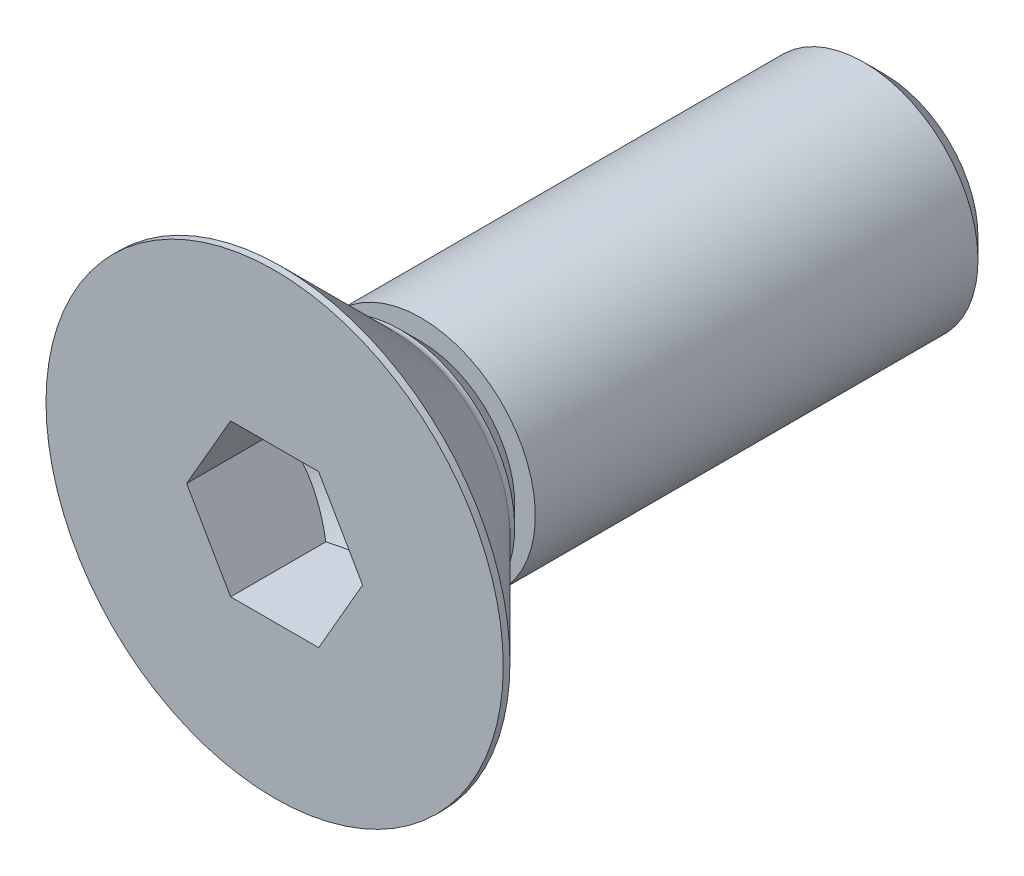
ISO-10303-21;
HEADER;
FILE_DESCRIPTION(('STEP AP214'),'2;1');
FILE_NAME('part.step','',(''),(''),'','','');
FILE_SCHEMA(('AUTOMOTIVE_DESIGN { 1 0 10303 214 1 1 1 1 }'));
ENDSEC;
DATA;
#1=APPLICATION_CONTEXT('core data for automotive mechanical design processes');
#2=APPLICATION_PROTOCOL_DEFINITION('international standard','automotive_design',2000,#1);
#3=PRODUCT_CONTEXT('',#1,'mechanical');
#4=PRODUCT('Part','Part','',(#3));
#5=PRODUCT_RELATED_PRODUCT_CATEGORY('part','',(#4));
#6=PRODUCT_DEFINITION_FORMATION('','',#4);
#7=PRODUCT_DEFINITION_CONTEXT('part definition',#1,'design');
#8=PRODUCT_DEFINITION('design','',#6,#7);
#9=PRODUCT_DEFINITION_SHAPE('','',#8);
#10=(LENGTH_UNIT() NAMED_UNIT(*) SI_UNIT(.MILLI.,.METRE.));
#11=(NAMED_UNIT(*) PLANE_ANGLE_UNIT() SI_UNIT($,.RADIAN.));
#12=(NAMED_UNIT(*) SI_UNIT($,.STERADIAN.) SOLID_ANGLE_UNIT());
#13=UNCERTAINTY_MEASURE_WITH_UNIT(LENGTH_MEASURE(1.E-05),#10,'distance_accuracy_value','');
#14=(GEOMETRIC_REPRESENTATION_CONTEXT(3) GLOBAL_UNCERTAINTY_ASSIGNED_CONTEXT((#13)) GLOBAL_UNIT_ASSIGNED_CONTEXT((#10,
#11,#12)) REPRESENTATION_CONTEXT('',''));
#15=CARTESIAN_POINT('',(0.,0.,0.));
#16=DIRECTION('',(0.,0.,1.));
#17=DIRECTION('',(1.,0.,0.));
#18=AXIS2_PLACEMENT_3D('',#15,#16,#17);
#19=CARTESIAN_POINT('',(0.,1.229375,-16.));
#20=DIRECTION('',(0.,0.,-1.));
#21=DIRECTION('',(0.,1.,0.));
#22=AXIS2_PLACEMENT_3D('',#19,#20,#21);
#23=PLANE('',#22);
#24=CARTESIAN_POINT('',(0.,0.,-16.));
#25=DIRECTION('',(0.,0.,-1.));
#26=DIRECTION('',(0.,1.,0.));
#27=AXIS2_PLACEMENT_3D('',#24,#25,#26);
#28=CIRCLE('',#27,2.45875);
#29=CARTESIAN_POINT('',(0.,2.45875,-16.));
#30=VERTEX_POINT('',#29);
#31=EDGE_CURVE('E11',#30,#30,#28,.T.);
#32=ORIENTED_EDGE('',*,*,#31,.T.);
#33=EDGE_LOOP('',(#32));
#34=FACE_BOUND('',#33,.T.);
#35=ADVANCED_FACE('F16',(#34),#23,.T.);
#36=CARTESIAN_POINT('',(0.,0.,-15.729375));
#37=DIRECTION('',(0.,0.,1.));
#38=DIRECTION('',(0.,1.,0.));
#39=AXIS2_PLACEMENT_3D('',#36,#37,#38);
#40=CONICAL_SURFACE('',#39,2.729375,0.785398163397448);
#41=CARTESIAN_POINT('',(0.,0.,-15.45875));
#42=DIRECTION('',(0.,0.,-1.));
#43=DIRECTION('',(0.,1.,0.));
#44=AXIS2_PLACEMENT_3D('',#41,#42,#43);
#45=CIRCLE('',#44,3.);
#46=CARTESIAN_POINT('',(0.,3.,-15.45875));
#47=VERTEX_POINT('',#46);
#48=EDGE_CURVE('E25',#47,#47,#45,.T.);
#49=ORIENTED_EDGE('',*,*,#48,.T.);
#50=EDGE_LOOP('',(#49));
#51=FACE_BOUND('',#50,.T.);
#52=ORIENTED_EDGE('',*,*,#31,.F.);
#53=EDGE_LOOP('',(#52));
#54=FACE_BOUND('',#53,.T.);
#55=ADVANCED_FACE('F189',(#51,#54),#40,.T.);
#56=CARTESIAN_POINT('',(0.,0.,-9.529375));
#57=DIRECTION('',(0.,0.,1.));
#58=DIRECTION('',(0.,1.,0.));
#59=AXIS2_PLACEMENT_3D('',#56,#57,#58);
#60=CYLINDRICAL_SURFACE('',#59,3.);
#61=ORIENTED_EDGE('',*,*,#48,.F.);
#62=EDGE_LOOP('',(#61));
#63=FACE_BOUND('',#62,.T.);
#64=CARTESIAN_POINT('',(0.,0.,-3.84125));
#65=DIRECTION('',(0.,0.,-1.));
#66=DIRECTION('',(0.,1.,0.));
#67=AXIS2_PLACEMENT_3D('',#64,#65,#66);
#68=CIRCLE('',#67,3.);
#69=CARTESIAN_POINT('',(0.,-3.,-3.84125));
#70=VERTEX_POINT('',#69);
#71=EDGE_CURVE('E98',#70,#70,#68,.T.);
#72=ORIENTED_EDGE('',*,*,#71,.T.);
#73=EDGE_LOOP('',(#72));
#74=FACE_BOUND('',#73,.T.);
#75=ADVANCED_FACE('F193',(#63,#74),#60,.T.);
#76=CARTESIAN_POINT('',(0.,0.,-3.3));
#77=DIRECTION('',(0.,0.,-1.));
#78=DIRECTION('',(-1.,0.,0.));
#79=AXIS2_PLACEMENT_3D('',#76,#77,#78);
#80=TOROIDAL_SURFACE('',#79,3.3,0.3);
#81=CARTESIAN_POINT('',(0.,0.,-3.08786796564404));
#82=DIRECTION('',(0.,0.,-1.));
#83=DIRECTION('',(0.,1.,0.));
#84=AXIS2_PLACEMENT_3D('',#81,#82,#83);
#85=CIRCLE('',#84,3.08786796564404);
#86=CARTESIAN_POINT('',(0.,3.08786796564404,-3.08786796564404));
#87=VERTEX_POINT('',#86);
#88=EDGE_CURVE('E124',#87,#87,#85,.T.);
#89=ORIENTED_EDGE('',*,*,#88,.T.);
#90=EDGE_LOOP('',(#89));
#91=FACE_BOUND('',#90,.T.);
#92=CARTESIAN_POINT('',(0.,0.,-3.3));
#93=DIRECTION('',(0.,0.,-1.));
#94=DIRECTION('',(0.,1.,0.));
#95=AXIS2_PLACEMENT_3D('',#92,#93,#94);
#96=CIRCLE('',#95,3.);
#97=CARTESIAN_POINT('',(0.,3.,-3.3));
#98=VERTEX_POINT('',#97);
#99=EDGE_CURVE('E19',#98,#98,#96,.T.);
#100=ORIENTED_EDGE('',*,*,#99,.F.);
#101=EDGE_LOOP('',(#100));
#102=FACE_BOUND('',#101,.T.);
#103=ADVANCED_FACE('F199',(#91,#102),#80,.F.);
#104=CARTESIAN_POINT('',(0.,0.,-1.63180194846605));
#105=DIRECTION('',(0.,0.,1.));
#106=DIRECTION('',(0.,1.,0.));
#107=AXIS2_PLACEMENT_3D('',#104,#105,#106);
#108=CONICAL_SURFACE('',#107,4.54393398282202,0.785398163397448);
#109=CARTESIAN_POINT('',(0.,0.,-0.17573593128807));
#110=DIRECTION('',(0.,0.,-1.));
#111=DIRECTION('',(0.,1.,0.));
#112=AXIS2_PLACEMENT_3D('',#109,#110,#111);
#113=CIRCLE('',#112,6.);
#114=CARTESIAN_POINT('',(0.,6.,-0.17573593128807));
#115=VERTEX_POINT('',#114);
#116=EDGE_CURVE('E133',#115,#115,#113,.T.);
#117=ORIENTED_EDGE('',*,*,#116,.T.);
#118=EDGE_LOOP('',(#117));
#119=FACE_BOUND('',#118,.T.);
#120=ORIENTED_EDGE('',*,*,#88,.F.);
#121=EDGE_LOOP('',(#120));
#122=FACE_BOUND('',#121,.T.);
#123=ADVANCED_FACE('F222',(#119,#122),#108,.T.);
#124=CARTESIAN_POINT('',(0.,0.,-0.0878679656440351));
#125=DIRECTION('',(0.,0.,1.));
#126=DIRECTION('',(0.,1.,0.));
#127=AXIS2_PLACEMENT_3D('',#124,#125,#126);
#128=CYLINDRICAL_SURFACE('',#127,6.);
#129=CARTESIAN_POINT('',(0.,0.,0.));
#130=DIRECTION('',(0.,0.,-1.));
#131=DIRECTION('',(0.,1.,0.));
#132=AXIS2_PLACEMENT_3D('',#129,#130,#131);
#133=CIRCLE('',#132,6.);
#134=CARTESIAN_POINT('',(0.,6.,0.));
#135=VERTEX_POINT('',#134);
#136=EDGE_CURVE('E69',#135,#135,#133,.T.);
#137=ORIENTED_EDGE('',*,*,#136,.T.);
#138=EDGE_LOOP('',(#137));
#139=FACE_BOUND('',#138,.T.);
#140=ORIENTED_EDGE('',*,*,#116,.F.);
#141=EDGE_LOOP('',(#140));
#142=FACE_BOUND('',#141,.T.);
#143=ADVANCED_FACE('F216',(#139,#142),#128,.T.);
#144=CARTESIAN_POINT('',(0.,3.,0.));
#145=DIRECTION('',(0.,0.,1.));
#146=DIRECTION('',(0.,-1.,0.));
#147=AXIS2_PLACEMENT_3D('',#144,#145,#146);
#148=PLANE('',#147);
#149=ORIENTED_EDGE('',*,*,#136,.F.);
#150=EDGE_LOOP('',(#149));
#151=FACE_BOUND('',#150,.T.);
#152=DIRECTION('',(-0.5,0.866025403784439,0.));
#153=VECTOR('',#152,1.);
#154=CARTESIAN_POINT('',(-2.38156905283833,0.125000466250108,0.));
#155=LINE('',#154,#153);
#156=CARTESIAN_POINT('',(-1.1547,-1.99999906749978,0.));
#157=VERTEX_POINT('',#156);
#158=CARTESIAN_POINT('',(-2.3094,0.,0.));
#159=VERTEX_POINT('',#158);
#160=EDGE_CURVE('E66',#157,#159,#155,.T.);
#161=ORIENTED_EDGE('',*,*,#160,.T.);
#162=DIRECTION('',(0.5,0.866025403784439,0.));
#163=VECTOR('',#162,1.);
#164=CARTESIAN_POINT('',(-1.08253094716167,2.12499953374989,0.));
#165=LINE('',#164,#163);
#166=CARTESIAN_POINT('',(-1.1547,1.99999906749978,0.));
#167=VERTEX_POINT('',#166);
#168=EDGE_CURVE('E56',#159,#167,#165,.T.);
#169=ORIENTED_EDGE('',*,*,#168,.T.);
#170=DIRECTION('',(1.,0.,0.));
#171=VECTOR('',#170,1.);
#172=CARTESIAN_POINT('',(0.,1.99999906749978,0.));
#173=LINE('',#172,#171);
#174=CARTESIAN_POINT('',(1.1547,1.99999906749978,0.));
#175=VERTEX_POINT('',#174);
#176=EDGE_CURVE('E62',#167,#175,#173,.T.);
#177=ORIENTED_EDGE('',*,*,#176,.T.);
#178=DIRECTION('',(0.5,-0.866025403784439,0.));
#179=VECTOR('',#178,1.);
#180=CARTESIAN_POINT('',(1.08253094716167,2.12499953374989,0.));
#181=LINE('',#180,#179);
#182=CARTESIAN_POINT('',(2.3094,0.,0.));
#183=VERTEX_POINT('',#182);
#184=EDGE_CURVE('E146',#175,#183,#181,.T.);
#185=ORIENTED_EDGE('',*,*,#184,.T.);
#186=DIRECTION('',(-0.5,-0.866025403784439,0.));
#187=VECTOR('',#186,1.);
#188=CARTESIAN_POINT('',(2.38156905283833,0.125000466250108,0.));
#189=LINE('',#188,#187);
#190=CARTESIAN_POINT('',(1.1547,-1.99999906749978,0.));
#191=VERTEX_POINT('',#190);
#192=EDGE_CURVE('E97',#183,#191,#189,.T.);
#193=ORIENTED_EDGE('',*,*,#192,.T.);
#194=DIRECTION('',(-1.,0.,0.));
#195=VECTOR('',#194,1.);
#196=CARTESIAN_POINT('',(0.,-1.99999906749978,0.));
#197=LINE('',#196,#195);
#198=EDGE_CURVE('E121',#191,#157,#197,.T.);
#199=ORIENTED_EDGE('',*,*,#198,.T.);
#200=EDGE_LOOP('',(#161,#169,#177,#185,#193,#199));
#201=FACE_BOUND('',#200,.T.);
#202=ADVANCED_FACE('F58',(#151,#201),#148,.T.);
#203=CARTESIAN_POINT('',(-1.73205,0.999999533749891,1.));
#204=DIRECTION('',(-0.866025403784439,0.5,0.));
#205=DIRECTION('',(0.5,0.866025403784439,0.));
#206=AXIS2_PLACEMENT_3D('',#203,#204,#205);
#207=PLANE('',#206);
#208=ORIENTED_EDGE('',*,*,#168,.F.);
#209=DIRECTION('',(0.,0.,-1.));
#210=VECTOR('',#209,1.);
#211=CARTESIAN_POINT('',(-2.3094,0.,1.));
#212=LINE('',#211,#210);
#213=CARTESIAN_POINT('',(-2.3094,0.,-2.5));
#214=VERTEX_POINT('',#213);
#215=EDGE_CURVE('E84',#159,#214,#212,.T.);
#216=ORIENTED_EDGE('',*,*,#215,.T.);
#217=CARTESIAN_POINT('',(-2.3094,0.,-2.5));
#218=CARTESIAN_POINT('',(-1.73205,0.999999533749893,-2.83333317791663));
#219=CARTESIAN_POINT('',(-1.1547,1.99999906749978,-2.5));
#220=(BOUNDED_CURVE() B_SPLINE_CURVE(2,(#217,#218,#219),.UNSPECIFIED.,.F.,
.F.) B_SPLINE_CURVE_WITH_KNOTS((3,3),(0.,2.33687118658889),
.UNSPECIFIED.) CURVE() GEOMETRIC_REPRESENTATION_ITEM() RATIONAL_B_SPLINE_CURVE((1.,
1.15470053837925,1.)) REPRESENTATION_ITEM(''));
#221=CARTESIAN_POINT('',(-1.1547,1.99999906749978,-2.5));
#222=VERTEX_POINT('',#221);
#223=EDGE_CURVE('E75',#214,#222,#220,.T.);
#224=ORIENTED_EDGE('',*,*,#223,.T.);
#225=DIRECTION('',(0.,0.,-1.));
#226=VECTOR('',#225,1.);
#227=CARTESIAN_POINT('',(-1.1547,1.99999906749978,1.));
#228=LINE('',#227,#226);
#229=EDGE_CURVE('E70',#167,#222,#228,.T.);
#230=ORIENTED_EDGE('',*,*,#229,.F.);
#231=EDGE_LOOP('',(#208,#216,#224,#230));
#232=FACE_BOUND('',#231,.T.);
#233=ADVANCED_FACE('F73',(#232),#207,.F.);
#234=CARTESIAN_POINT('',(0.,1.99999906749978,1.));
#235=DIRECTION('',(0.,1.,0.));
#236=DIRECTION('',(1.,0.,0.));
#237=AXIS2_PLACEMENT_3D('',#234,#235,#236);
#238=PLANE('',#237);
#239=ORIENTED_EDGE('',*,*,#176,.F.);
#240=ORIENTED_EDGE('',*,*,#229,.T.);
#241=CARTESIAN_POINT('',(-1.1547,1.99999906749978,-2.5));
#242=CARTESIAN_POINT('',(0.,1.99999906749979,-2.83333317791663));
#243=CARTESIAN_POINT('',(1.1547,1.99999906749978,-2.5));
#244=(BOUNDED_CURVE() B_SPLINE_CURVE(2,(#241,#242,#243),.UNSPECIFIED.,.F.,
.F.) B_SPLINE_CURVE_WITH_KNOTS((3,3),(0.,2.33687118658889),
.UNSPECIFIED.) CURVE() GEOMETRIC_REPRESENTATION_ITEM() RATIONAL_B_SPLINE_CURVE((1.,
1.15470053837925,1.)) REPRESENTATION_ITEM(''));
#245=CARTESIAN_POINT('',(1.1547,1.99999906749978,-2.5));
#246=VERTEX_POINT('',#245);
#247=EDGE_CURVE('E103',#222,#246,#244,.T.);
#248=ORIENTED_EDGE('',*,*,#247,.T.);
#249=DIRECTION('',(0.,0.,-1.));
#250=VECTOR('',#249,1.);
#251=CARTESIAN_POINT('',(1.1547,1.99999906749978,1.));
#252=LINE('',#251,#250);
#253=EDGE_CURVE('E82',#175,#246,#252,.T.);
#254=ORIENTED_EDGE('',*,*,#253,.F.);
#255=EDGE_LOOP('',(#239,#240,#248,#254));
#256=FACE_BOUND('',#255,.T.);
#257=ADVANCED_FACE('F80',(#256),#238,.F.);
#258=CARTESIAN_POINT('',(-1.73205,-0.999999533749891,1.));
#259=DIRECTION('',(-0.866025403784439,-0.5,0.));
#260=DIRECTION('',(-0.5,0.866025403784439,0.));
#261=AXIS2_PLACEMENT_3D('',#258,#259,#260);
#262=PLANE('',#261);
#263=ORIENTED_EDGE('',*,*,#160,.F.);
#264=DIRECTION('',(0.,0.,-1.));
#265=VECTOR('',#264,1.);
#266=CARTESIAN_POINT('',(-1.1547,-1.99999906749978,1.));
#267=LINE('',#266,#265);
#268=CARTESIAN_POINT('',(-1.1547,-1.99999906749978,-2.5));
#269=VERTEX_POINT('',#268);
#270=EDGE_CURVE('E106',#157,#269,#267,.T.);
#271=ORIENTED_EDGE('',*,*,#270,.T.);
#272=CARTESIAN_POINT('',(-1.1547,-1.99999906749978,-2.5));
#273=CARTESIAN_POINT('',(-1.73205,-0.999999533749891,-2.83333317791663));
#274=CARTESIAN_POINT('',(-2.3094,0.,-2.5));
#275=(BOUNDED_CURVE() B_SPLINE_CURVE(2,(#272,#273,#274),.UNSPECIFIED.,.F.,
.F.) B_SPLINE_CURVE_WITH_KNOTS((3,3),(0.,2.33687118658889),
.UNSPECIFIED.) CURVE() GEOMETRIC_REPRESENTATION_ITEM() RATIONAL_B_SPLINE_CURVE((1.,
1.15470053837925,1.)) REPRESENTATION_ITEM(''));
#276=EDGE_CURVE('E112',#269,#214,#275,.T.);
#277=ORIENTED_EDGE('',*,*,#276,.T.);
#278=ORIENTED_EDGE('',*,*,#215,.F.);
#279=EDGE_LOOP('',(#263,#271,#277,#278));
#280=FACE_BOUND('',#279,.T.);
#281=ADVANCED_FACE('F209',(#280),#262,.F.);
#282=CARTESIAN_POINT('',(0.,0.,-3.16666635583326));
#283=DIRECTION('',(0.,0.,1.));
#284=DIRECTION('',(0.,1.,0.));
#285=AXIS2_PLACEMENT_3D('',#282,#283,#284);
#286=CONICAL_SURFACE('',#285,1.1547,1.0471975511966);
#287=CARTESIAN_POINT('',(0.,0.,-3.83333271166652));
#288=VERTEX_POINT('',#287);
#289=VERTEX_LOOP('',#288);
#290=FACE_BOUND('',#289,.T.);
#291=CARTESIAN_POINT('',(1.1547,1.99999906749978,-2.5));
#292=CARTESIAN_POINT('',(1.73205,0.999999533749893,-2.83333317791663));
#293=CARTESIAN_POINT('',(2.3094,0.,-2.5));
#294=(BOUNDED_CURVE() B_SPLINE_CURVE(2,(#291,#292,#293),.UNSPECIFIED.,.F.,
.F.) B_SPLINE_CURVE_WITH_KNOTS((3,3),(0.,2.33687118658889),
.UNSPECIFIED.) CURVE() GEOMETRIC_REPRESENTATION_ITEM() RATIONAL_B_SPLINE_CURVE((1.,
1.15470053837925,1.)) REPRESENTATION_ITEM(''));
#295=CARTESIAN_POINT('',(2.3094,0.,-2.5));
#296=VERTEX_POINT('',#295);
#297=EDGE_CURVE('E139',#246,#296,#294,.T.);
#298=ORIENTED_EDGE('',*,*,#297,.F.);
#299=ORIENTED_EDGE('',*,*,#247,.F.);
#300=ORIENTED_EDGE('',*,*,#223,.F.);
#301=ORIENTED_EDGE('',*,*,#276,.F.);
#302=CARTESIAN_POINT('',(1.1547,-1.99999906749978,-2.5));
#303=CARTESIAN_POINT('',(0.,-1.99999906749979,-2.83333317791663));
#304=CARTESIAN_POINT('',(-1.1547,-1.99999906749978,-2.5));
#305=(BOUNDED_CURVE() B_SPLINE_CURVE(2,(#302,#303,#304),.UNSPECIFIED.,.F.,
.F.) B_SPLINE_CURVE_WITH_KNOTS((3,3),(0.,2.33687118658889),
.UNSPECIFIED.) CURVE() GEOMETRIC_REPRESENTATION_ITEM() RATIONAL_B_SPLINE_CURVE((1.,
1.15470053837925,1.)) REPRESENTATION_ITEM(''));
#306=CARTESIAN_POINT('',(1.1547,-1.99999906749978,-2.5));
#307=VERTEX_POINT('',#306);
#308=EDGE_CURVE('E115',#307,#269,#305,.T.);
#309=ORIENTED_EDGE('',*,*,#308,.F.);
#310=CARTESIAN_POINT('',(2.3094,0.,-2.5));
#311=CARTESIAN_POINT('',(1.73205,-0.999999533749891,-2.83333317791663));
#312=CARTESIAN_POINT('',(1.1547,-1.99999906749978,-2.5));
#313=(BOUNDED_CURVE() B_SPLINE_CURVE(2,(#310,#311,#312),.UNSPECIFIED.,.F.,
.F.) B_SPLINE_CURVE_WITH_KNOTS((3,3),(0.,2.33687118658888),
.UNSPECIFIED.) CURVE() GEOMETRIC_REPRESENTATION_ITEM() RATIONAL_B_SPLINE_CURVE((1.,
1.15470053837925,1.)) REPRESENTATION_ITEM(''));
#314=EDGE_CURVE('E91',#296,#307,#313,.T.);
#315=ORIENTED_EDGE('',*,*,#314,.F.);
#316=EDGE_LOOP('',(#298,#299,#300,#301,#309,#315));
#317=FACE_BOUND('',#316,.T.);
#318=ADVANCED_FACE('F205',(#290,#317),#286,.F.);
#319=CARTESIAN_POINT('',(0.,-1.99999906749978,1.));
#320=DIRECTION('',(0.,-1.,0.));
#321=DIRECTION('',(-1.,0.,0.));
#322=AXIS2_PLACEMENT_3D('',#319,#320,#321);
#323=PLANE('',#322);
#324=ORIENTED_EDGE('',*,*,#198,.F.);
#325=DIRECTION('',(0.,0.,-1.));
#326=VECTOR('',#325,1.);
#327=CARTESIAN_POINT('',(1.1547,-1.99999906749978,1.));
#328=LINE('',#327,#326);
#329=EDGE_CURVE('E96',#191,#307,#328,.T.);
#330=ORIENTED_EDGE('',*,*,#329,.T.);
#331=ORIENTED_EDGE('',*,*,#308,.T.);
#332=ORIENTED_EDGE('',*,*,#270,.F.);
#333=EDGE_LOOP('',(#324,#330,#331,#332));
#334=FACE_BOUND('',#333,.T.);
#335=ADVANCED_FACE('F211',(#334),#323,.F.);
#336=CARTESIAN_POINT('',(1.73205,-0.999999533749891,1.));
#337=DIRECTION('',(0.866025403784439,-0.5,0.));
#338=DIRECTION('',(-0.5,-0.866025403784439,0.));
#339=AXIS2_PLACEMENT_3D('',#336,#337,#338);
#340=PLANE('',#339);
#341=ORIENTED_EDGE('',*,*,#192,.F.);
#342=DIRECTION('',(0.,0.,-1.));
#343=VECTOR('',#342,1.);
#344=CARTESIAN_POINT('',(2.3094,0.,1.));
#345=LINE('',#344,#343);
#346=EDGE_CURVE('E136',#183,#296,#345,.T.);
#347=ORIENTED_EDGE('',*,*,#346,.T.);
#348=ORIENTED_EDGE('',*,*,#314,.T.);
#349=ORIENTED_EDGE('',*,*,#329,.F.);
#350=EDGE_LOOP('',(#341,#347,#348,#349));
#351=FACE_BOUND('',#350,.T.);
#352=ADVANCED_FACE('F186',(#351),#340,.F.);
#353=CARTESIAN_POINT('',(1.73205,0.999999533749891,1.));
#354=DIRECTION('',(0.866025403784439,0.5,0.));
#355=DIRECTION('',(0.5,-0.866025403784439,0.));
#356=AXIS2_PLACEMENT_3D('',#353,#354,#355);
#357=PLANE('',#356);
#358=ORIENTED_EDGE('',*,*,#184,.F.);
#359=ORIENTED_EDGE('',*,*,#253,.T.);
#360=ORIENTED_EDGE('',*,*,#297,.T.);
#361=ORIENTED_EDGE('',*,*,#346,.F.);
#362=EDGE_LOOP('',(#358,#359,#360,#361));
#363=FACE_BOUND('',#362,.T.);
#364=ADVANCED_FACE('F178',(#363),#357,.F.);
#365=CARTESIAN_POINT('',(0.,0.,-3.570625));
#366=DIRECTION('',(0.,0.,1.));
#367=DIRECTION('',(0.,1.,0.));
#368=AXIS2_PLACEMENT_3D('',#365,#366,#367);
#369=CONICAL_SURFACE('',#368,2.729375,0.785398163397448);
#370=CARTESIAN_POINT('',(0.,0.,-3.84125));
#371=DIRECTION('',(0.,0.,-1.));
#372=DIRECTION('',(0.,1.,0.));
#373=AXIS2_PLACEMENT_3D('',#370,#371,#372);
#374=CIRCLE('',#373,2.45875);
#375=CARTESIAN_POINT('',(0.,2.45875,-3.84125));
#376=VERTEX_POINT('',#375);
#377=EDGE_CURVE('E89',#376,#376,#374,.T.);
#378=ORIENTED_EDGE('',*,*,#377,.F.);
#379=EDGE_LOOP('',(#378));
#380=FACE_BOUND('',#379,.T.);
#381=ORIENTED_EDGE('',*,*,#99,.T.);
#382=EDGE_LOOP('',(#381));
#383=FACE_BOUND('',#382,.T.);
#384=ADVANCED_FACE('F176',(#380,#383),#369,.T.);
#385=CARTESIAN_POINT('',(0.,3.229375,-3.84125));
#386=DIRECTION('',(0.,0.,-1.));
#387=DIRECTION('',(0.,1.,0.));
#388=AXIS2_PLACEMENT_3D('',#385,#386,#387);
#389=PLANE('',#388);
#390=ORIENTED_EDGE('',*,*,#377,.T.);
#391=EDGE_LOOP('',(#390));
#392=FACE_BOUND('',#391,.T.);
#393=ORIENTED_EDGE('',*,*,#71,.F.);
#394=EDGE_LOOP('',(#393));
#395=FACE_BOUND('',#394,.T.);
#396=ADVANCED_FACE('F171',(#392,#395),#389,.F.);
#397=CLOSED_SHELL('',(#35,#55,#75,#103,#123,#143,#202,#233,#257,#281,#318,#335,#352,#364,#384,#396));
#398=MANIFOLD_SOLID_BREP('B1',#397);
#399=ADVANCED_BREP_SHAPE_REPRESENTATION('',(#18,#398),#14);
#400=SHAPE_DEFINITION_REPRESENTATION(#9,#399);
ENDSEC;
END-ISO-10303-21;
